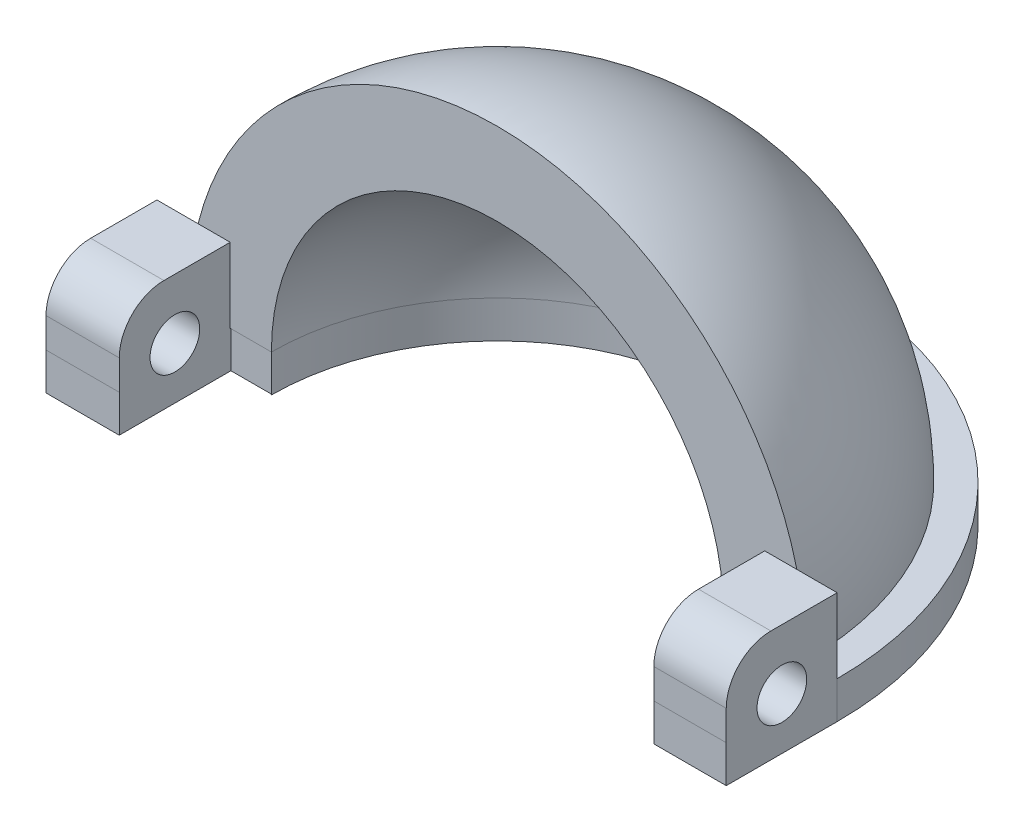
ISO-10303-21;
HEADER;
FILE_DESCRIPTION(('STEP AP214'),'2;1');
FILE_NAME('part.step','',(''),(''),'','','');
FILE_SCHEMA(('AUTOMOTIVE_DESIGN { 1 0 10303 214 1 1 1 1 }'));
ENDSEC;
DATA;
#1=APPLICATION_CONTEXT('core data for automotive mechanical design processes');
#2=APPLICATION_PROTOCOL_DEFINITION('international standard','automotive_design',2000,#1);
#3=PRODUCT_CONTEXT('',#1,'mechanical');
#4=PRODUCT('Part','Part','',(#3));
#5=PRODUCT_RELATED_PRODUCT_CATEGORY('part','',(#4));
#6=PRODUCT_DEFINITION_FORMATION('','',#4);
#7=PRODUCT_DEFINITION_CONTEXT('part definition',#1,'design');
#8=PRODUCT_DEFINITION('design','',#6,#7);
#9=PRODUCT_DEFINITION_SHAPE('','',#8);
#10=(LENGTH_UNIT() NAMED_UNIT(*) SI_UNIT(.MILLI.,.METRE.));
#11=(NAMED_UNIT(*) PLANE_ANGLE_UNIT() SI_UNIT($,.RADIAN.));
#12=(NAMED_UNIT(*) SI_UNIT($,.STERADIAN.) SOLID_ANGLE_UNIT());
#13=UNCERTAINTY_MEASURE_WITH_UNIT(LENGTH_MEASURE(1.E-05),#10,'distance_accuracy_value','');
#14=(GEOMETRIC_REPRESENTATION_CONTEXT(3) GLOBAL_UNCERTAINTY_ASSIGNED_CONTEXT((#13)) GLOBAL_UNIT_ASSIGNED_CONTEXT((#10,
#11,#12)) REPRESENTATION_CONTEXT('',''));
#15=CARTESIAN_POINT('',(0.,0.,0.));
#16=DIRECTION('',(0.,0.,1.));
#17=DIRECTION('',(1.,0.,0.));
#18=AXIS2_PLACEMENT_3D('',#15,#16,#17);
#19=CARTESIAN_POINT('',(23.2099691197334,0.,0.));
#20=DIRECTION('',(0.,-1.,0.));
#21=DIRECTION('',(0.,0.,-1.));
#22=AXIS2_PLACEMENT_3D('',#19,#20,#21);
#23=PLANE('',#22);
#24=CARTESIAN_POINT('',(23.2099691197334,0.,0.));
#25=DIRECTION('',(0.,1.,0.));
#26=DIRECTION('',(0.,0.,-1.));
#27=AXIS2_PLACEMENT_3D('',#24,#25,#26);
#28=CIRCLE('',#27,23.2099691197334);
#29=CARTESIAN_POINT('',(46.4199382394668,0.,0.));
#30=VERTEX_POINT('',#29);
#31=CARTESIAN_POINT('',(0.,0.,0.));
#32=VERTEX_POINT('',#31);
#33=EDGE_CURVE('E324',#30,#32,#28,.T.);
#34=ORIENTED_EDGE('',*,*,#33,.F.);
#35=DIRECTION('',(-0.999948416046486,0.,-0.0101570293947094));
#36=VECTOR('',#35,1.);
#37=CARTESIAN_POINT('',(23.2123635819102,0.,-0.235732177974427));
#38=LINE('',#37,#36);
#39=CARTESIAN_POINT('',(41.4977628366429,0.,-0.0499972593086982));
#40=VERTEX_POINT('',#39);
#41=EDGE_CURVE('E11',#30,#40,#38,.T.);
#42=ORIENTED_EDGE('',*,*,#41,.T.);
#43=DIRECTION('',(1.,0.,0.));
#44=VECTOR('',#43,1.);
#45=CARTESIAN_POINT('',(38.664807537657,0.,-0.0499972593086982));
#46=LINE('',#45,#44);
#47=CARTESIAN_POINT('',(38.664807537657,0.,-0.0499972593086982));
#48=VERTEX_POINT('',#47);
#49=EDGE_CURVE('E213',#48,#40,#46,.T.);
#50=ORIENTED_EDGE('',*,*,#49,.F.);
#51=DIRECTION('',(0.,0.,1.));
#52=VECTOR('',#51,1.);
#53=CARTESIAN_POINT('',(38.664807537657,0.,-0.0499972593086982));
#54=LINE('',#53,#52);
#55=CARTESIAN_POINT('',(38.664807537657,0.,0.));
#56=VERTEX_POINT('',#55);
#57=EDGE_CURVE('E194',#48,#56,#54,.T.);
#58=ORIENTED_EDGE('',*,*,#57,.T.);
#59=CARTESIAN_POINT('',(23.2380511651513,0.,0.));
#60=DIRECTION('',(0.,-1.,0.));
#61=DIRECTION('',(0.,0.,-1.));
#62=AXIS2_PLACEMENT_3D('',#59,#60,#61);
#63=CIRCLE('',#62,15.4267563725057);
#64=CARTESIAN_POINT('',(7.81129479264564,0.,0.));
#65=VERTEX_POINT('',#64);
#66=EDGE_CURVE('E340',#65,#56,#63,.T.);
#67=ORIENTED_EDGE('',*,*,#66,.F.);
#68=DIRECTION('',(0.,0.,1.));
#69=VECTOR('',#68,1.);
#70=CARTESIAN_POINT('',(7.81129479264564,0.,-0.0499972593086982));
#71=LINE('',#70,#69);
#72=CARTESIAN_POINT('',(7.81129479264564,0.,-0.0499972593086982));
#73=VERTEX_POINT('',#72);
#74=EDGE_CURVE('E254',#73,#65,#71,.T.);
#75=ORIENTED_EDGE('',*,*,#74,.F.);
#76=DIRECTION('',(1.,0.,0.));
#77=VECTOR('',#76,1.);
#78=CARTESIAN_POINT('',(4.99931890190692,0.,-0.0499972593086982));
#79=LINE('',#78,#77);
#80=CARTESIAN_POINT('',(4.99931890190692,0.,-0.0499972593086982));
#81=VERTEX_POINT('',#80);
#82=EDGE_CURVE('E236',#81,#73,#79,.T.);
#83=ORIENTED_EDGE('',*,*,#82,.F.);
#84=DIRECTION('',(0.,0.,1.));
#85=VECTOR('',#84,1.);
#86=CARTESIAN_POINT('',(4.99931890190692,0.,-0.0499972593086982));
#87=LINE('',#86,#85);
#88=CARTESIAN_POINT('',(4.99931890190692,0.,7.57000274069132));
#89=VERTEX_POINT('',#88);
#90=EDGE_CURVE('E245',#81,#89,#87,.T.);
#91=ORIENTED_EDGE('',*,*,#90,.T.);
#92=DIRECTION('',(1.,0.,0.));
#93=VECTOR('',#92,1.);
#94=CARTESIAN_POINT('',(0.,0.,7.57000274069132));
#95=LINE('',#94,#93);
#96=CARTESIAN_POINT('',(0.,0.,7.57000274069132));
#97=VERTEX_POINT('',#96);
#98=EDGE_CURVE('E337',#97,#89,#95,.T.);
#99=ORIENTED_EDGE('',*,*,#98,.F.);
#100=DIRECTION('',(0.,0.,1.));
#101=VECTOR('',#100,1.);
#102=CARTESIAN_POINT('',(0.,0.,0.));
#103=LINE('',#102,#101);
#104=EDGE_CURVE('E334',#32,#97,#103,.T.);
#105=ORIENTED_EDGE('',*,*,#104,.F.);
#106=EDGE_LOOP('',(#34,#42,#50,#58,#67,#75,#83,#91,#99,#105));
#107=FACE_BOUND('',#106,.T.);
#108=ADVANCED_FACE('F35',(#107),#23,.T.);
#109=CARTESIAN_POINT('',(0.,4.572,4.52200274069132));
#110=DIRECTION('',(-1.,0.,0.));
#111=DIRECTION('',(0.,0.,1.));
#112=AXIS2_PLACEMENT_3D('',#109,#110,#111);
#113=CYLINDRICAL_SURFACE('',#112,3.048);
#114=DIRECTION('',(-1.,0.,0.));
#115=VECTOR('',#114,1.);
#116=CARTESIAN_POINT('',(0.,4.572,7.57000274069132));
#117=LINE('',#116,#115);
#118=CARTESIAN_POINT('',(4.99931890190692,4.572,7.57000274069132));
#119=VERTEX_POINT('',#118);
#120=CARTESIAN_POINT('',(0.,4.572,7.57000274069132));
#121=VERTEX_POINT('',#120);
#122=EDGE_CURVE('E384',#119,#121,#117,.T.);
#123=ORIENTED_EDGE('',*,*,#122,.F.);
#124=CARTESIAN_POINT('',(4.99931890190692,4.572,4.52200274069132));
#125=DIRECTION('',(-1.,0.,0.));
#126=DIRECTION('',(0.,0.,1.));
#127=AXIS2_PLACEMENT_3D('',#124,#125,#126);
#128=CIRCLE('',#127,3.048);
#129=CARTESIAN_POINT('',(4.99931890190692,7.62,4.52200274069132));
#130=VERTEX_POINT('',#129);
#131=EDGE_CURVE('E390',#130,#119,#128,.F.);
#132=ORIENTED_EDGE('',*,*,#131,.F.);
#133=DIRECTION('',(-1.,0.,0.));
#134=VECTOR('',#133,1.);
#135=CARTESIAN_POINT('',(0.,7.62,4.52200274069132));
#136=LINE('',#135,#134);
#137=CARTESIAN_POINT('',(0.,7.62,4.52200274069132));
#138=VERTEX_POINT('',#137);
#139=EDGE_CURVE('E387',#138,#130,#136,.F.);
#140=ORIENTED_EDGE('',*,*,#139,.F.);
#141=CARTESIAN_POINT('',(0.,4.572,4.52200274069132));
#142=DIRECTION('',(1.,0.,0.));
#143=DIRECTION('',(0.,0.,-1.));
#144=AXIS2_PLACEMENT_3D('',#141,#142,#143);
#145=CIRCLE('',#144,3.048);
#146=EDGE_CURVE('E59',#121,#138,#145,.F.);
#147=ORIENTED_EDGE('',*,*,#146,.F.);
#148=EDGE_LOOP('',(#123,#132,#140,#147));
#149=FACE_BOUND('',#148,.T.);
#150=ADVANCED_FACE('F37',(#149),#113,.T.);
#151=CARTESIAN_POINT('',(0.,2.54,7.57000274069132));
#152=DIRECTION('',(0.,0.,-1.));
#153=DIRECTION('',(-1.,0.,0.));
#154=AXIS2_PLACEMENT_3D('',#151,#152,#153);
#155=PLANE('',#154);
#156=DIRECTION('',(0.,-1.,0.));
#157=VECTOR('',#156,1.);
#158=CARTESIAN_POINT('',(4.99931890190692,7.62,7.57000274069132));
#159=LINE('',#158,#157);
#160=CARTESIAN_POINT('',(4.99931890190692,2.54,7.57000274069132));
#161=VERTEX_POINT('',#160);
#162=EDGE_CURVE('E276',#119,#161,#159,.T.);
#163=ORIENTED_EDGE('',*,*,#162,.F.);
#164=ORIENTED_EDGE('',*,*,#122,.T.);
#165=DIRECTION('',(0.,-1.,0.));
#166=VECTOR('',#165,1.);
#167=CARTESIAN_POINT('',(0.,2.54,7.57000274069132));
#168=LINE('',#167,#166);
#169=CARTESIAN_POINT('',(0.,2.54000000000058,7.57000274069132));
#170=VERTEX_POINT('',#169);
#171=EDGE_CURVE('E357',#121,#170,#168,.T.);
#172=ORIENTED_EDGE('',*,*,#171,.T.);
#173=DIRECTION('',(-1.,-2.31703882831254E-13,0.));
#174=VECTOR('',#173,1.);
#175=CARTESIAN_POINT('',(0.,2.54,7.57000274069132));
#176=LINE('',#175,#174);
#177=EDGE_CURVE('E380',#161,#170,#176,.T.);
#178=ORIENTED_EDGE('',*,*,#177,.F.);
#179=EDGE_LOOP('',(#163,#164,#172,#178));
#180=FACE_BOUND('',#179,.T.);
#181=ADVANCED_FACE('F483',(#180),#155,.F.);
#182=CARTESIAN_POINT('',(38.664807537657,4.572,4.52200274069132));
#183=DIRECTION('',(1.,0.,0.));
#184=DIRECTION('',(0.,0.,-1.));
#185=AXIS2_PLACEMENT_3D('',#182,#183,#184);
#186=CYLINDRICAL_SURFACE('',#185,3.048);
#187=DIRECTION('',(-1.,0.,0.));
#188=VECTOR('',#187,1.);
#189=CARTESIAN_POINT('',(38.664807537657,4.572,7.57000274069132));
#190=LINE('',#189,#188);
#191=CARTESIAN_POINT('',(46.4199382394668,4.572,7.57000274069132));
#192=VERTEX_POINT('',#191);
#193=CARTESIAN_POINT('',(41.4772711538672,4.572,7.57000274069132));
#194=VERTEX_POINT('',#193);
#195=EDGE_CURVE('E370',#192,#194,#190,.T.);
#196=ORIENTED_EDGE('',*,*,#195,.F.);
#197=CARTESIAN_POINT('',(46.4199382394668,4.572,4.52200274069132));
#198=DIRECTION('',(-1.,0.,0.));
#199=DIRECTION('',(0.,0.,1.));
#200=AXIS2_PLACEMENT_3D('',#197,#198,#199);
#201=CIRCLE('',#200,3.048);
#202=CARTESIAN_POINT('',(46.4199382394668,7.62,4.52200274069132));
#203=VERTEX_POINT('',#202);
#204=EDGE_CURVE('E376',#203,#192,#201,.F.);
#205=ORIENTED_EDGE('',*,*,#204,.F.);
#206=DIRECTION('',(-1.,0.,0.));
#207=VECTOR('',#206,1.);
#208=CARTESIAN_POINT('',(38.664807537657,7.62,4.52200274069132));
#209=LINE('',#208,#207);
#210=CARTESIAN_POINT('',(41.4772711538672,7.62,4.52200274069132));
#211=VERTEX_POINT('',#210);
#212=EDGE_CURVE('E373',#211,#203,#209,.F.);
#213=ORIENTED_EDGE('',*,*,#212,.F.);
#214=CARTESIAN_POINT('',(41.4772711538672,4.572,4.52200274069132));
#215=DIRECTION('',(1.,0.,0.));
#216=DIRECTION('',(0.,0.,-1.));
#217=AXIS2_PLACEMENT_3D('',#214,#215,#216);
#218=CIRCLE('',#217,3.048);
#219=EDGE_CURVE('E378',#194,#211,#218,.F.);
#220=ORIENTED_EDGE('',*,*,#219,.F.);
#221=EDGE_LOOP('',(#196,#205,#213,#220));
#222=FACE_BOUND('',#221,.T.);
#223=ADVANCED_FACE('F456',(#222),#186,.T.);
#224=CARTESIAN_POINT('',(38.664807537657,2.54,7.57000274069132));
#225=DIRECTION('',(0.,0.,-1.));
#226=DIRECTION('',(-1.,0.,0.));
#227=AXIS2_PLACEMENT_3D('',#224,#225,#226);
#228=PLANE('',#227);
#229=DIRECTION('',(1.,0.,0.));
#230=VECTOR('',#229,1.);
#231=CARTESIAN_POINT('',(38.664807537657,2.54,7.57000274069132));
#232=LINE('',#231,#230);
#233=CARTESIAN_POINT('',(41.4977628366429,2.54,7.57000274069132));
#234=VERTEX_POINT('',#233);
#235=CARTESIAN_POINT('',(46.4199382394668,2.54,7.57000274069132));
#236=VERTEX_POINT('',#235);
#237=EDGE_CURVE('E365',#234,#236,#232,.T.);
#238=ORIENTED_EDGE('',*,*,#237,.F.);
#239=DIRECTION('',(0.,1.,0.));
#240=VECTOR('',#239,1.);
#241=CARTESIAN_POINT('',(41.4977628366429,2.54,7.57000274069132));
#242=LINE('',#241,#240);
#243=CARTESIAN_POINT('',(41.4977628366429,0.,7.57000274069132));
#244=VERTEX_POINT('',#243);
#245=EDGE_CURVE('E216',#244,#234,#242,.T.);
#246=ORIENTED_EDGE('',*,*,#245,.F.);
#247=DIRECTION('',(1.,0.,0.));
#248=VECTOR('',#247,1.);
#249=CARTESIAN_POINT('',(38.664807537657,0.,7.57000274069132));
#250=LINE('',#249,#248);
#251=CARTESIAN_POINT('',(46.4199382394668,0.,7.57000274069132));
#252=VERTEX_POINT('',#251);
#253=EDGE_CURVE('E342',#244,#252,#250,.T.);
#254=ORIENTED_EDGE('',*,*,#253,.T.);
#255=DIRECTION('',(0.,-1.,0.));
#256=VECTOR('',#255,1.);
#257=CARTESIAN_POINT('',(46.4199382394668,2.54,7.57000274069132));
#258=LINE('',#257,#256);
#259=EDGE_CURVE('E348',#236,#252,#258,.T.);
#260=ORIENTED_EDGE('',*,*,#259,.F.);
#261=EDGE_LOOP('',(#238,#246,#254,#260));
#262=FACE_BOUND('',#261,.T.);
#263=ADVANCED_FACE('F420',(#262),#228,.F.);
#264=CARTESIAN_POINT('',(23.2099691197334,2.54,0.));
#265=DIRECTION('',(0.,-1.,0.));
#266=DIRECTION('',(0.,0.,-1.));
#267=AXIS2_PLACEMENT_3D('',#264,#265,#266);
#268=PLANE('',#267);
#269=DIRECTION('',(-1.,0.,0.));
#270=VECTOR('',#269,1.);
#271=CARTESIAN_POINT('',(4.99931890190692,2.54,0.));
#272=LINE('',#271,#270);
#273=CARTESIAN_POINT('',(2.1873430111682,2.54,0.));
#274=VERTEX_POINT('',#273);
#275=CARTESIAN_POINT('',(0.,2.54,0.));
#276=VERTEX_POINT('',#275);
#277=EDGE_CURVE('E266',#274,#276,#272,.T.);
#278=ORIENTED_EDGE('',*,*,#277,.F.);
#279=CARTESIAN_POINT('',(23.2385388906228,2.54,0.));
#280=DIRECTION('',(0.,1.,0.));
#281=DIRECTION('',(0.,0.,-1.));
#282=AXIS2_PLACEMENT_3D('',#279,#280,#281);
#283=CIRCLE('',#282,21.0511958794546);
#284=CARTESIAN_POINT('',(44.2897347700774,2.54,0.));
#285=VERTEX_POINT('',#284);
#286=EDGE_CURVE('E308',#285,#274,#283,.T.);
#287=ORIENTED_EDGE('',*,*,#286,.F.);
#288=DIRECTION('',(-1.,0.,0.));
#289=VECTOR('',#288,1.);
#290=CARTESIAN_POINT('',(46.4199382394668,2.54,0.));
#291=LINE('',#290,#289);
#292=CARTESIAN_POINT('',(46.4199382394668,2.54,0.));
#293=VERTEX_POINT('',#292);
#294=EDGE_CURVE('E287',#293,#285,#291,.T.);
#295=ORIENTED_EDGE('',*,*,#294,.F.);
#296=CARTESIAN_POINT('',(23.2099691197334,2.54,0.));
#297=DIRECTION('',(0.,1.,0.));
#298=DIRECTION('',(0.,0.,-1.));
#299=AXIS2_PLACEMENT_3D('',#296,#297,#298);
#300=CIRCLE('',#299,23.2099691197334);
#301=EDGE_CURVE('E325',#293,#276,#300,.T.);
#302=ORIENTED_EDGE('',*,*,#301,.T.);
#303=EDGE_LOOP('',(#278,#287,#295,#302));
#304=FACE_BOUND('',#303,.T.);
#305=ADVANCED_FACE('F445',(#304),#268,.F.);
#306=CARTESIAN_POINT('',(23.2385388906228,2.54000000000064,6.34041430469523E-13));
#307=DIRECTION('',(0.,0.,-1.));
#308=DIRECTION('',(0.,1.,0.));
#309=AXIS2_PLACEMENT_3D('',#306,#307,#308);
#310=PLANE('',#309);
#311=DIRECTION('',(0.,-1.,0.));
#312=VECTOR('',#311,1.);
#313=CARTESIAN_POINT('',(4.99931890190692,7.62,0.));
#314=LINE('',#313,#312);
#315=CARTESIAN_POINT('',(4.99931890190691,7.62,1.31484313442523E-12));
#316=VERTEX_POINT('',#315);
#317=CARTESIAN_POINT('',(4.99931890190692,2.54,1.2059648527192E-12));
#318=VERTEX_POINT('',#317);
#319=EDGE_CURVE('E284',#316,#318,#314,.T.);
#320=ORIENTED_EDGE('',*,*,#319,.T.);
#321=DIRECTION('',(1.,0.,0.));
#322=VECTOR('',#321,1.);
#323=CARTESIAN_POINT('',(2.18734301116819,2.54000000000129,1.2941037130787E-12));
#324=LINE('',#323,#322);
#325=CARTESIAN_POINT('',(7.81129479264564,2.54,6.34041430469523E-13));
#326=VERTEX_POINT('',#325);
#327=EDGE_CURVE('E314',#318,#326,#324,.T.);
#328=ORIENTED_EDGE('',*,*,#327,.T.);
#329=CARTESIAN_POINT('',(23.2380511651513,2.54000000000064,6.34041430469523E-13));
#330=DIRECTION('',(0.,0.,-1.));
#331=DIRECTION('',(0.,-1.,0.));
#332=AXIS2_PLACEMENT_3D('',#329,#330,#331);
#333=CIRCLE('',#332,15.4267563725057);
#334=CARTESIAN_POINT('',(38.664807537657,2.54,6.34041430469523E-13));
#335=VERTEX_POINT('',#334);
#336=EDGE_CURVE('E318',#326,#335,#333,.T.);
#337=ORIENTED_EDGE('',*,*,#336,.T.);
#338=DIRECTION('',(1.,0.,0.));
#339=VECTOR('',#338,1.);
#340=CARTESIAN_POINT('',(38.664807537657,2.54,1.50487261540988E-13));
#341=LINE('',#340,#339);
#342=CARTESIAN_POINT('',(41.4772711538672,2.54,0.));
#343=VERTEX_POINT('',#342);
#344=EDGE_CURVE('E321',#335,#343,#341,.T.);
#345=ORIENTED_EDGE('',*,*,#344,.T.);
#346=DIRECTION('',(0.,-1.,0.));
#347=VECTOR('',#346,1.);
#348=CARTESIAN_POINT('',(41.4772711538672,7.62,0.));
#349=LINE('',#348,#347);
#350=CARTESIAN_POINT('',(41.4772711538672,7.62,0.));
#351=VERTEX_POINT('',#350);
#352=EDGE_CURVE('E303',#351,#343,#349,.T.);
#353=ORIENTED_EDGE('',*,*,#352,.F.);
#354=DIRECTION('',(1.,0.,0.));
#355=VECTOR('',#354,1.);
#356=CARTESIAN_POINT('',(23.2385388906228,7.62,7.43145069705384E-13));
#357=LINE('',#356,#355);
#358=CARTESIAN_POINT('',(43.6675978007922,7.62,1.02807738930427E-13));
#359=VERTEX_POINT('',#358);
#360=EDGE_CURVE('E362',#351,#359,#357,.T.);
#361=ORIENTED_EDGE('',*,*,#360,.T.);
#362=CARTESIAN_POINT('',(23.2385388906228,2.54000000000064,6.34041430469523E-13));
#363=DIRECTION('',(0.,0.,1.));
#364=DIRECTION('',(0.,1.,0.));
#365=AXIS2_PLACEMENT_3D('',#362,#363,#364);
#366=CIRCLE('',#365,21.0511958794546);
#367=CARTESIAN_POINT('',(2.80947998045337,7.62,1.38348240048034E-12));
#368=VERTEX_POINT('',#367);
#369=EDGE_CURVE('E315',#359,#368,#366,.T.);
#370=ORIENTED_EDGE('',*,*,#369,.T.);
#371=DIRECTION('',(-1.,0.,0.));
#372=VECTOR('',#371,1.);
#373=CARTESIAN_POINT('',(4.99931890190692,7.62,0.));
#374=LINE('',#373,#372);
#375=EDGE_CURVE('E270',#316,#368,#374,.T.);
#376=ORIENTED_EDGE('',*,*,#375,.F.);
#377=EDGE_LOOP('',(#320,#328,#337,#345,#353,#361,#370,#376));
#378=FACE_BOUND('',#377,.T.);
#379=ADVANCED_FACE('F515',(#378),#310,.F.);
#380=CARTESIAN_POINT('',(23.2099691197334,2.54,0.));
#381=DIRECTION('',(0.,-1.,0.));
#382=DIRECTION('',(0.,0.,-1.));
#383=AXIS2_PLACEMENT_3D('',#380,#381,#382);
#384=CYLINDRICAL_SURFACE('',#383,23.2099691197334);
#385=ORIENTED_EDGE('',*,*,#33,.T.);
#386=DIRECTION('',(0.,-1.,0.));
#387=VECTOR('',#386,1.);
#388=CARTESIAN_POINT('',(0.,2.54,0.));
#389=LINE('',#388,#387);
#390=EDGE_CURVE('E359',#276,#32,#389,.T.);
#391=ORIENTED_EDGE('',*,*,#390,.F.);
#392=ORIENTED_EDGE('',*,*,#301,.F.);
#393=DIRECTION('',(0.,-1.,0.));
#394=VECTOR('',#393,1.);
#395=CARTESIAN_POINT('',(46.4199382394668,2.54,0.));
#396=LINE('',#395,#394);
#397=EDGE_CURVE('E331',#293,#30,#396,.T.);
#398=ORIENTED_EDGE('',*,*,#397,.T.);
#399=EDGE_LOOP('',(#385,#391,#392,#398));
#400=FACE_BOUND('',#399,.T.);
#401=ADVANCED_FACE('F432',(#400),#384,.T.);
#402=CARTESIAN_POINT('',(0.,2.54,0.));
#403=DIRECTION('',(1.,0.,0.));
#404=DIRECTION('',(0.,0.,-1.));
#405=AXIS2_PLACEMENT_3D('',#402,#403,#404);
#406=PLANE('',#405);
#407=CARTESIAN_POINT('',(0.,3.53654246078802,3.77459142830657));
#408=DIRECTION('',(1.,0.,0.));
#409=DIRECTION('',(0.,0.,-1.));
#410=AXIS2_PLACEMENT_3D('',#407,#408,#409);
#411=CIRCLE('',#410,1.69551181155846);
#412=CARTESIAN_POINT('',(0.,3.53654246078802,2.0790796167481));
#413=VERTEX_POINT('',#412);
#414=EDGE_CURVE('E263',#413,#413,#411,.T.);
#415=ORIENTED_EDGE('',*,*,#414,.T.);
#416=EDGE_LOOP('',(#415));
#417=FACE_BOUND('',#416,.T.);
#418=ORIENTED_EDGE('',*,*,#171,.F.);
#419=ORIENTED_EDGE('',*,*,#146,.T.);
#420=DIRECTION('',(0.,0.,1.));
#421=VECTOR('',#420,1.);
#422=CARTESIAN_POINT('',(0.,7.62,0.));
#423=LINE('',#422,#421);
#424=CARTESIAN_POINT('',(0.,7.62,0.));
#425=VERTEX_POINT('',#424);
#426=EDGE_CURVE('E273',#425,#138,#423,.T.);
#427=ORIENTED_EDGE('',*,*,#426,.F.);
#428=DIRECTION('',(0.,-1.,0.));
#429=VECTOR('',#428,1.);
#430=CARTESIAN_POINT('',(0.,7.62,0.));
#431=LINE('',#430,#429);
#432=EDGE_CURVE('E281',#425,#276,#431,.T.);
#433=ORIENTED_EDGE('',*,*,#432,.T.);
#434=ORIENTED_EDGE('',*,*,#390,.T.);
#435=ORIENTED_EDGE('',*,*,#104,.T.);
#436=EDGE_CURVE('E356',#170,#97,#168,.T.);
#437=ORIENTED_EDGE('',*,*,#436,.F.);
#438=EDGE_LOOP('',(#418,#419,#427,#433,#434,#435,#437));
#439=FACE_BOUND('',#438,.T.);
#440=ADVANCED_FACE('F436',(#417,#439),#406,.F.);
#441=ORIENTED_EDGE('',*,*,#98,.T.);
#442=DIRECTION('',(0.,-1.,0.));
#443=VECTOR('',#442,1.);
#444=CARTESIAN_POINT('',(4.99931890190692,2.54,7.57000274069132));
#445=LINE('',#444,#443);
#446=EDGE_CURVE('E228',#161,#89,#445,.T.);
#447=ORIENTED_EDGE('',*,*,#446,.F.);
#448=ORIENTED_EDGE('',*,*,#177,.T.);
#449=ORIENTED_EDGE('',*,*,#436,.T.);
#450=EDGE_LOOP('',(#441,#447,#448,#449));
#451=FACE_BOUND('',#450,.T.);
#452=ADVANCED_FACE('F506',(#451),#155,.F.);
#453=CARTESIAN_POINT('',(23.2380511651513,2.54,0.));
#454=DIRECTION('',(0.,-1.,0.));
#455=DIRECTION('',(0.,0.,-1.));
#456=AXIS2_PLACEMENT_3D('',#453,#454,#455);
#457=CYLINDRICAL_SURFACE('',#456,15.4267563725057);
#458=ORIENTED_EDGE('',*,*,#66,.T.);
#459=DIRECTION('',(0.,-1.,0.));
#460=VECTOR('',#459,1.);
#461=CARTESIAN_POINT('',(38.664807537657,2.54,1.50668790599245E-13));
#462=LINE('',#461,#460);
#463=EDGE_CURVE('E201',#335,#56,#462,.T.);
#464=ORIENTED_EDGE('',*,*,#463,.F.);
#465=CARTESIAN_POINT('',(23.2380511651513,2.54,0.));
#466=DIRECTION('',(0.,-1.,0.));
#467=DIRECTION('',(0.,0.,-1.));
#468=AXIS2_PLACEMENT_3D('',#465,#466,#467);
#469=CIRCLE('',#468,15.4267563725057);
#470=EDGE_CURVE('E327',#326,#335,#469,.T.);
#471=ORIENTED_EDGE('',*,*,#470,.F.);
#472=DIRECTION('',(0.,-1.,0.));
#473=VECTOR('',#472,1.);
#474=CARTESIAN_POINT('',(7.81129479264564,2.54,-1.78053101776432E-13));
#475=LINE('',#474,#473);
#476=EDGE_CURVE('E353',#326,#65,#475,.T.);
#477=ORIENTED_EDGE('',*,*,#476,.T.);
#478=EDGE_LOOP('',(#458,#464,#471,#477));
#479=FACE_BOUND('',#478,.T.);
#480=ADVANCED_FACE('F500',(#479),#457,.F.);
#481=EDGE_CURVE('E349',#192,#236,#258,.T.);
#482=ORIENTED_EDGE('',*,*,#481,.F.);
#483=ORIENTED_EDGE('',*,*,#195,.T.);
#484=DIRECTION('',(0.,-1.,0.));
#485=VECTOR('',#484,1.);
#486=CARTESIAN_POINT('',(41.4772711538672,7.62,7.57000274069132));
#487=LINE('',#486,#485);
#488=CARTESIAN_POINT('',(41.4772711538672,2.54,7.57000274069132));
#489=VERTEX_POINT('',#488);
#490=EDGE_CURVE('E296',#194,#489,#487,.T.);
#491=ORIENTED_EDGE('',*,*,#490,.T.);
#492=EDGE_CURVE('E366',#489,#234,#232,.T.);
#493=ORIENTED_EDGE('',*,*,#492,.T.);
#494=ORIENTED_EDGE('',*,*,#237,.T.);
#495=EDGE_LOOP('',(#482,#483,#491,#493,#494));
#496=FACE_BOUND('',#495,.T.);
#497=ADVANCED_FACE('F459',(#496),#228,.F.);
#498=CARTESIAN_POINT('',(46.4199382394668,2.54,7.57000274069132));
#499=DIRECTION('',(-1.,0.,0.));
#500=DIRECTION('',(0.,0.,1.));
#501=AXIS2_PLACEMENT_3D('',#498,#499,#500);
#502=PLANE('',#501);
#503=CARTESIAN_POINT('',(46.4199382394668,3.53654246078802,3.77459142830657));
#504=DIRECTION('',(1.,0.,0.));
#505=DIRECTION('',(0.,0.,-1.));
#506=AXIS2_PLACEMENT_3D('',#503,#504,#505);
#507=CIRCLE('',#506,1.69551181155846);
#508=CARTESIAN_POINT('',(46.4199382394668,3.53654246078802,2.0790796167481));
#509=VERTEX_POINT('',#508);
#510=EDGE_CURVE('E250',#509,#509,#507,.T.);
#511=ORIENTED_EDGE('',*,*,#510,.F.);
#512=EDGE_LOOP('',(#511));
#513=FACE_BOUND('',#512,.T.);
#514=DIRECTION('',(0.,0.,-1.));
#515=VECTOR('',#514,1.);
#516=CARTESIAN_POINT('',(46.4199382394668,7.62,7.57000274069132));
#517=LINE('',#516,#515);
#518=CARTESIAN_POINT('',(46.4199382394668,7.62,0.));
#519=VERTEX_POINT('',#518);
#520=EDGE_CURVE('E288',#203,#519,#517,.T.);
#521=ORIENTED_EDGE('',*,*,#520,.F.);
#522=ORIENTED_EDGE('',*,*,#204,.T.);
#523=ORIENTED_EDGE('',*,*,#481,.T.);
#524=ORIENTED_EDGE('',*,*,#259,.T.);
#525=DIRECTION('',(0.,0.,-1.));
#526=VECTOR('',#525,1.);
#527=CARTESIAN_POINT('',(46.4199382394668,0.,7.57000274069132));
#528=LINE('',#527,#526);
#529=EDGE_CURVE('E328',#252,#30,#528,.T.);
#530=ORIENTED_EDGE('',*,*,#529,.T.);
#531=ORIENTED_EDGE('',*,*,#397,.F.);
#532=DIRECTION('',(0.,-1.,0.));
#533=VECTOR('',#532,1.);
#534=CARTESIAN_POINT('',(46.4199382394668,7.62,0.));
#535=LINE('',#534,#533);
#536=EDGE_CURVE('E306',#519,#293,#535,.T.);
#537=ORIENTED_EDGE('',*,*,#536,.F.);
#538=EDGE_LOOP('',(#521,#522,#523,#524,#530,#531,#537));
#539=FACE_BOUND('',#538,.T.);
#540=ADVANCED_FACE('F428',(#513,#539),#502,.F.);
#541=ORIENTED_EDGE('',*,*,#41,.F.);
#542=ORIENTED_EDGE('',*,*,#529,.F.);
#543=ORIENTED_EDGE('',*,*,#253,.F.);
#544=DIRECTION('',(0.,0.,1.));
#545=VECTOR('',#544,1.);
#546=CARTESIAN_POINT('',(41.4977628366429,0.,-0.0499972593086982));
#547=LINE('',#546,#545);
#548=EDGE_CURVE('E206',#40,#244,#547,.T.);
#549=ORIENTED_EDGE('',*,*,#548,.F.);
#550=EDGE_LOOP('',(#541,#542,#543,#549));
#551=FACE_BOUND('',#550,.T.);
#552=ADVANCED_FACE('F424',(#551),#23,.T.);
#553=CARTESIAN_POINT('',(23.2385388906228,2.54000000000064,6.34041430469523E-13));
#554=DIRECTION('',(-1.,0.,0.));
#555=DIRECTION('',(0.,-1.,0.));
#556=AXIS2_PLACEMENT_3D('',#553,#554,#555);
#557=SPHERICAL_SURFACE('',#556,21.0511958794546);
#558=ORIENTED_EDGE('',*,*,#286,.T.);
#559=EDGE_CURVE('E310',#368,#274,#366,.T.);
#560=ORIENTED_EDGE('',*,*,#559,.F.);
#561=ORIENTED_EDGE('',*,*,#369,.F.);
#562=EDGE_CURVE('E311',#285,#359,#366,.T.);
#563=ORIENTED_EDGE('',*,*,#562,.F.);
#564=EDGE_LOOP('',(#558,#560,#561,#563));
#565=FACE_BOUND('',#564,.T.);
#566=ADVANCED_FACE('F488',(#565),#557,.T.);
#567=CARTESIAN_POINT('',(23.2380511651513,2.54000000000064,6.34041430469523E-13));
#568=DIRECTION('',(-1.,0.,0.));
#569=DIRECTION('',(0.,1.,0.));
#570=AXIS2_PLACEMENT_3D('',#567,#568,#569);
#571=SPHERICAL_SURFACE('',#570,15.4267563725057);
#572=ORIENTED_EDGE('',*,*,#470,.T.);
#573=ORIENTED_EDGE('',*,*,#336,.F.);
#574=EDGE_LOOP('',(#572,#573));
#575=FACE_BOUND('',#574,.T.);
#576=ADVANCED_FACE('F493',(#575),#571,.F.);
#577=CARTESIAN_POINT('',(46.4199382394668,7.62,0.));
#578=DIRECTION('',(0.,0.,1.));
#579=DIRECTION('',(1.,0.,0.));
#580=AXIS2_PLACEMENT_3D('',#577,#578,#579);
#581=PLANE('',#580);
#582=ORIENTED_EDGE('',*,*,#294,.T.);
#583=ORIENTED_EDGE('',*,*,#562,.T.);
#584=DIRECTION('',(-1.,0.,0.));
#585=VECTOR('',#584,1.);
#586=CARTESIAN_POINT('',(46.4199382394668,7.62,0.));
#587=LINE('',#586,#585);
#588=EDGE_CURVE('E290',#519,#359,#587,.T.);
#589=ORIENTED_EDGE('',*,*,#588,.F.);
#590=ORIENTED_EDGE('',*,*,#536,.T.);
#591=EDGE_LOOP('',(#582,#583,#589,#590));
#592=FACE_BOUND('',#591,.T.);
#593=ADVANCED_FACE('F449',(#592),#581,.F.);
#594=CARTESIAN_POINT('',(41.4772711538672,7.62,7.57000274069132));
#595=DIRECTION('',(1.,0.,0.));
#596=DIRECTION('',(0.,0.,-1.));
#597=AXIS2_PLACEMENT_3D('',#594,#595,#596);
#598=PLANE('',#597);
#599=DIRECTION('',(0.,0.,1.));
#600=VECTOR('',#599,1.);
#601=CARTESIAN_POINT('',(41.4772711538672,2.54,7.57000274069132));
#602=LINE('',#601,#600);
#603=CARTESIAN_POINT('',(41.4772711538672,2.54,2.40285405293881));
#604=VERTEX_POINT('',#603);
#605=EDGE_CURVE('E291',#343,#604,#602,.T.);
#606=ORIENTED_EDGE('',*,*,#605,.T.);
#607=CARTESIAN_POINT('',(41.4772711538672,3.53654246078802,3.77459142830657));
#608=DIRECTION('',(1.,0.,0.));
#609=DIRECTION('',(0.,0.,-1.));
#610=AXIS2_PLACEMENT_3D('',#607,#608,#609);
#611=CIRCLE('',#610,1.69551181155846);
#612=CARTESIAN_POINT('',(41.4772711538672,2.54,5.14632880367433));
#613=VERTEX_POINT('',#612);
#614=EDGE_CURVE('E260',#604,#613,#611,.T.);
#615=ORIENTED_EDGE('',*,*,#614,.T.);
#616=EDGE_CURVE('E298',#613,#489,#602,.T.);
#617=ORIENTED_EDGE('',*,*,#616,.T.);
#618=ORIENTED_EDGE('',*,*,#490,.F.);
#619=ORIENTED_EDGE('',*,*,#219,.T.);
#620=DIRECTION('',(0.,0.,1.));
#621=VECTOR('',#620,1.);
#622=CARTESIAN_POINT('',(41.4772711538672,7.62,7.57000274069132));
#623=LINE('',#622,#621);
#624=EDGE_CURVE('E293',#351,#211,#623,.T.);
#625=ORIENTED_EDGE('',*,*,#624,.F.);
#626=ORIENTED_EDGE('',*,*,#352,.T.);
#627=EDGE_LOOP('',(#606,#615,#617,#618,#619,#625,#626));
#628=FACE_BOUND('',#627,.T.);
#629=ADVANCED_FACE('F408',(#628),#598,.F.);
#630=CARTESIAN_POINT('',(0.,7.62,0.));
#631=DIRECTION('',(0.,1.,0.));
#632=DIRECTION('',(0.,0.,1.));
#633=AXIS2_PLACEMENT_3D('',#630,#631,#632);
#634=PLANE('',#633);
#635=ORIENTED_EDGE('',*,*,#624,.T.);
#636=ORIENTED_EDGE('',*,*,#212,.T.);
#637=ORIENTED_EDGE('',*,*,#520,.T.);
#638=ORIENTED_EDGE('',*,*,#588,.T.);
#639=ORIENTED_EDGE('',*,*,#360,.F.);
#640=EDGE_LOOP('',(#635,#636,#637,#638,#639));
#641=FACE_BOUND('',#640,.T.);
#642=ADVANCED_FACE('F453',(#641),#634,.T.);
#643=CARTESIAN_POINT('',(4.99931890190692,7.62,0.));
#644=DIRECTION('',(-1.,0.,0.));
#645=DIRECTION('',(0.,0.,1.));
#646=AXIS2_PLACEMENT_3D('',#643,#644,#645);
#647=PLANE('',#646);
#648=CARTESIAN_POINT('',(4.99931890190692,3.53654246078802,3.77459142830657));
#649=DIRECTION('',(-1.,0.,0.));
#650=DIRECTION('',(0.,0.,1.));
#651=AXIS2_PLACEMENT_3D('',#648,#649,#650);
#652=CIRCLE('',#651,1.69551181155846);
#653=CARTESIAN_POINT('',(4.99931890190692,3.53654246078802,5.47010323986503));
#654=VERTEX_POINT('',#653);
#655=EDGE_CURVE('E393',#654,#654,#652,.T.);
#656=ORIENTED_EDGE('',*,*,#655,.T.);
#657=EDGE_LOOP('',(#656));
#658=FACE_BOUND('',#657,.T.);
#659=ORIENTED_EDGE('',*,*,#162,.T.);
#660=ORIENTED_EDGE('',*,*,#446,.T.);
#661=ORIENTED_EDGE('',*,*,#90,.F.);
#662=DIRECTION('',(0.,-1.,0.));
#663=VECTOR('',#662,1.);
#664=CARTESIAN_POINT('',(4.99931890190692,2.54,-0.0499972593086982));
#665=LINE('',#664,#663);
#666=CARTESIAN_POINT('',(4.99931890190692,2.54,-0.0499972593086982));
#667=VERTEX_POINT('',#666);
#668=EDGE_CURVE('E233',#667,#81,#665,.T.);
#669=ORIENTED_EDGE('',*,*,#668,.F.);
#670=DIRECTION('',(0.,0.,1.));
#671=VECTOR('',#670,1.);
#672=CARTESIAN_POINT('',(4.99931890190692,2.54,-0.0499972593086982));
#673=LINE('',#672,#671);
#674=EDGE_CURVE('E247',#667,#318,#673,.T.);
#675=ORIENTED_EDGE('',*,*,#674,.T.);
#676=ORIENTED_EDGE('',*,*,#319,.F.);
#677=DIRECTION('',(0.,0.,-1.));
#678=VECTOR('',#677,1.);
#679=CARTESIAN_POINT('',(4.99931890190692,7.62,0.));
#680=LINE('',#679,#678);
#681=EDGE_CURVE('E267',#130,#316,#680,.T.);
#682=ORIENTED_EDGE('',*,*,#681,.F.);
#683=ORIENTED_EDGE('',*,*,#131,.T.);
#684=EDGE_LOOP('',(#659,#660,#661,#669,#675,#676,#682,#683));
#685=FACE_BOUND('',#684,.T.);
#686=ADVANCED_FACE('F528',(#658,#685),#647,.F.);
#687=CARTESIAN_POINT('',(4.99931890190692,7.62,0.));
#688=DIRECTION('',(0.,0.,1.));
#689=DIRECTION('',(1.,0.,0.));
#690=AXIS2_PLACEMENT_3D('',#687,#688,#689);
#691=PLANE('',#690);
#692=EDGE_CURVE('E269',#368,#425,#374,.T.);
#693=ORIENTED_EDGE('',*,*,#692,.F.);
#694=ORIENTED_EDGE('',*,*,#559,.T.);
#695=ORIENTED_EDGE('',*,*,#277,.T.);
#696=ORIENTED_EDGE('',*,*,#432,.F.);
#697=EDGE_LOOP('',(#693,#694,#695,#696));
#698=FACE_BOUND('',#697,.T.);
#699=ADVANCED_FACE('F442',(#698),#691,.F.);
#700=CARTESIAN_POINT('',(0.,7.62,0.));
#701=DIRECTION('',(0.,-1.,0.));
#702=DIRECTION('',(0.,0.,-1.));
#703=AXIS2_PLACEMENT_3D('',#700,#701,#702);
#704=PLANE('',#703);
#705=ORIENTED_EDGE('',*,*,#426,.T.);
#706=ORIENTED_EDGE('',*,*,#139,.T.);
#707=ORIENTED_EDGE('',*,*,#681,.T.);
#708=ORIENTED_EDGE('',*,*,#375,.T.);
#709=ORIENTED_EDGE('',*,*,#692,.T.);
#710=EDGE_LOOP('',(#705,#706,#707,#708,#709));
#711=FACE_BOUND('',#710,.T.);
#712=ADVANCED_FACE('F532',(#711),#704,.F.);
#713=CARTESIAN_POINT('',(-4.12606176053326,3.53654246078802,3.77459142830657));
#714=DIRECTION('',(1.,0.,0.));
#715=DIRECTION('',(0.,0.,-1.));
#716=AXIS2_PLACEMENT_3D('',#713,#714,#715);
#717=CYLINDRICAL_SURFACE('',#716,1.69551181155846);
#718=ORIENTED_EDGE('',*,*,#655,.F.);
#719=EDGE_LOOP('',(#718));
#720=FACE_BOUND('',#719,.T.);
#721=ORIENTED_EDGE('',*,*,#414,.F.);
#722=EDGE_LOOP('',(#721));
#723=FACE_BOUND('',#722,.T.);
#724=ADVANCED_FACE('F569',(#720,#723),#717,.F.);
#725=ORIENTED_EDGE('',*,*,#510,.T.);
#726=EDGE_LOOP('',(#725));
#727=FACE_BOUND('',#726,.T.);
#728=CARTESIAN_POINT('',(41.4977628366429,3.53654246078802,3.77459142830657));
#729=DIRECTION('',(1.,0.,0.));
#730=DIRECTION('',(0.,0.,-1.));
#731=AXIS2_PLACEMENT_3D('',#728,#729,#730);
#732=CIRCLE('',#731,1.69551181155846);
#733=CARTESIAN_POINT('',(41.4977628366429,2.54,2.40285405293881));
#734=VERTEX_POINT('',#733);
#735=CARTESIAN_POINT('',(41.4977628366429,2.54,5.14632880367433));
#736=VERTEX_POINT('',#735);
#737=EDGE_CURVE('E396',#734,#736,#732,.F.);
#738=ORIENTED_EDGE('',*,*,#737,.T.);
#739=DIRECTION('',(1.,0.,0.));
#740=VECTOR('',#739,1.);
#741=CARTESIAN_POINT('',(-4.12606176053326,2.54,5.14632880367433));
#742=LINE('',#741,#740);
#743=EDGE_CURVE('E44',#736,#613,#742,.F.);
#744=ORIENTED_EDGE('',*,*,#743,.T.);
#745=ORIENTED_EDGE('',*,*,#614,.F.);
#746=DIRECTION('',(1.,0.,0.));
#747=VECTOR('',#746,1.);
#748=CARTESIAN_POINT('',(-4.12606176053326,2.54,2.40285405293881));
#749=LINE('',#748,#747);
#750=EDGE_CURVE('E399',#604,#734,#749,.T.);
#751=ORIENTED_EDGE('',*,*,#750,.T.);
#752=EDGE_LOOP('',(#738,#744,#745,#751));
#753=FACE_BOUND('',#752,.T.);
#754=ADVANCED_FACE('F404',(#727,#753),#717,.F.);
#755=CARTESIAN_POINT('',(4.99931890190692,2.54,-0.0499972593086982));
#756=DIRECTION('',(0.,1.,0.));
#757=DIRECTION('',(0.,0.,1.));
#758=AXIS2_PLACEMENT_3D('',#755,#756,#757);
#759=PLANE('',#758);
#760=ORIENTED_EDGE('',*,*,#674,.F.);
#761=DIRECTION('',(-1.,0.,0.));
#762=VECTOR('',#761,1.);
#763=CARTESIAN_POINT('',(4.99931890190692,2.54,-0.0499972593086982));
#764=LINE('',#763,#762);
#765=CARTESIAN_POINT('',(7.81129479264564,2.54,-0.0499972593086982));
#766=VERTEX_POINT('',#765);
#767=EDGE_CURVE('E242',#766,#667,#764,.T.);
#768=ORIENTED_EDGE('',*,*,#767,.F.);
#769=DIRECTION('',(0.,0.,1.));
#770=VECTOR('',#769,1.);
#771=CARTESIAN_POINT('',(7.81129479264564,2.54,-0.0499972593086982));
#772=LINE('',#771,#770);
#773=EDGE_CURVE('E251',#766,#326,#772,.T.);
#774=ORIENTED_EDGE('',*,*,#773,.T.);
#775=ORIENTED_EDGE('',*,*,#327,.F.);
#776=EDGE_LOOP('',(#760,#768,#774,#775));
#777=FACE_BOUND('',#776,.T.);
#778=ADVANCED_FACE('F540',(#777),#759,.F.);
#779=CARTESIAN_POINT('',(7.81129479264564,2.54,-0.0499972593086982));
#780=DIRECTION('',(1.,0.,0.));
#781=DIRECTION('',(0.,0.,-1.));
#782=AXIS2_PLACEMENT_3D('',#779,#780,#781);
#783=PLANE('',#782);
#784=ORIENTED_EDGE('',*,*,#476,.F.);
#785=ORIENTED_EDGE('',*,*,#773,.F.);
#786=DIRECTION('',(0.,1.,0.));
#787=VECTOR('',#786,1.);
#788=CARTESIAN_POINT('',(7.81129479264564,2.54,-0.0499972593086982));
#789=LINE('',#788,#787);
#790=EDGE_CURVE('E239',#73,#766,#789,.T.);
#791=ORIENTED_EDGE('',*,*,#790,.F.);
#792=ORIENTED_EDGE('',*,*,#74,.T.);
#793=EDGE_LOOP('',(#784,#785,#791,#792));
#794=FACE_BOUND('',#793,.T.);
#795=ADVANCED_FACE('F573',(#794),#783,.F.);
#796=CARTESIAN_POINT('',(0.,0.,-0.0499972593086982));
#797=DIRECTION('',(0.,0.,1.));
#798=DIRECTION('',(1.,0.,0.));
#799=AXIS2_PLACEMENT_3D('',#796,#797,#798);
#800=PLANE('',#799);
#801=ORIENTED_EDGE('',*,*,#668,.T.);
#802=ORIENTED_EDGE('',*,*,#82,.T.);
#803=ORIENTED_EDGE('',*,*,#790,.T.);
#804=ORIENTED_EDGE('',*,*,#767,.T.);
#805=EDGE_LOOP('',(#801,#802,#803,#804));
#806=FACE_BOUND('',#805,.T.);
#807=ADVANCED_FACE('F576',(#806),#800,.T.);
#808=CARTESIAN_POINT('',(38.664807537657,2.54,-0.0499972593086982));
#809=DIRECTION('',(-1.,0.,0.));
#810=DIRECTION('',(0.,0.,1.));
#811=AXIS2_PLACEMENT_3D('',#808,#809,#810);
#812=PLANE('',#811);
#813=ORIENTED_EDGE('',*,*,#57,.F.);
#814=DIRECTION('',(0.,-1.,0.));
#815=VECTOR('',#814,1.);
#816=CARTESIAN_POINT('',(38.664807537657,2.54,-0.0499972593086982));
#817=LINE('',#816,#815);
#818=CARTESIAN_POINT('',(38.664807537657,2.54,-0.0499972593086982));
#819=VERTEX_POINT('',#818);
#820=EDGE_CURVE('E198',#819,#48,#817,.T.);
#821=ORIENTED_EDGE('',*,*,#820,.F.);
#822=DIRECTION('',(0.,0.,1.));
#823=VECTOR('',#822,1.);
#824=CARTESIAN_POINT('',(38.664807537657,2.54,-0.0499972593086982));
#825=LINE('',#824,#823);
#826=EDGE_CURVE('E226',#819,#335,#825,.T.);
#827=ORIENTED_EDGE('',*,*,#826,.T.);
#828=ORIENTED_EDGE('',*,*,#463,.T.);
#829=EDGE_LOOP('',(#813,#821,#827,#828));
#830=FACE_BOUND('',#829,.T.);
#831=ADVANCED_FACE('F196',(#830),#812,.F.);
#832=CARTESIAN_POINT('',(38.664807537657,2.54,-0.0499972593086982));
#833=DIRECTION('',(0.,1.,0.));
#834=DIRECTION('',(0.,0.,1.));
#835=AXIS2_PLACEMENT_3D('',#832,#833,#834);
#836=PLANE('',#835);
#837=ORIENTED_EDGE('',*,*,#826,.F.);
#838=DIRECTION('',(-1.,0.,0.));
#839=VECTOR('',#838,1.);
#840=CARTESIAN_POINT('',(38.664807537657,2.54,-0.0499972593086982));
#841=LINE('',#840,#839);
#842=CARTESIAN_POINT('',(41.4977628366429,2.54,-0.0499972593086982));
#843=VERTEX_POINT('',#842);
#844=EDGE_CURVE('E207',#843,#819,#841,.T.);
#845=ORIENTED_EDGE('',*,*,#844,.F.);
#846=DIRECTION('',(0.,0.,1.));
#847=VECTOR('',#846,1.);
#848=CARTESIAN_POINT('',(41.4977628366429,2.54,-0.0499972593086982));
#849=LINE('',#848,#847);
#850=EDGE_CURVE('E229',#843,#734,#849,.T.);
#851=ORIENTED_EDGE('',*,*,#850,.T.);
#852=ORIENTED_EDGE('',*,*,#750,.F.);
#853=ORIENTED_EDGE('',*,*,#605,.F.);
#854=ORIENTED_EDGE('',*,*,#344,.F.);
#855=EDGE_LOOP('',(#837,#845,#851,#852,#853,#854));
#856=FACE_BOUND('',#855,.T.);
#857=ADVANCED_FACE('F413',(#856),#836,.F.);
#858=ORIENTED_EDGE('',*,*,#743,.F.);
#859=EDGE_CURVE('E51',#736,#234,#849,.T.);
#860=ORIENTED_EDGE('',*,*,#859,.T.);
#861=ORIENTED_EDGE('',*,*,#492,.F.);
#862=ORIENTED_EDGE('',*,*,#616,.F.);
#863=EDGE_LOOP('',(#858,#860,#861,#862));
#864=FACE_BOUND('',#863,.T.);
#865=ADVANCED_FACE('F469',(#864),#836,.F.);
#866=CARTESIAN_POINT('',(41.4977628366429,2.54,-0.0499972593086982));
#867=DIRECTION('',(1.,0.,0.));
#868=DIRECTION('',(0.,0.,-1.));
#869=AXIS2_PLACEMENT_3D('',#866,#867,#868);
#870=PLANE('',#869);
#871=ORIENTED_EDGE('',*,*,#850,.F.);
#872=DIRECTION('',(0.,1.,0.));
#873=VECTOR('',#872,1.);
#874=CARTESIAN_POINT('',(41.4977628366429,2.54,-0.0499972593086982));
#875=LINE('',#874,#873);
#876=EDGE_CURVE('E220',#40,#843,#875,.T.);
#877=ORIENTED_EDGE('',*,*,#876,.F.);
#878=ORIENTED_EDGE('',*,*,#548,.T.);
#879=ORIENTED_EDGE('',*,*,#245,.T.);
#880=ORIENTED_EDGE('',*,*,#859,.F.);
#881=ORIENTED_EDGE('',*,*,#737,.F.);
#882=EDGE_LOOP('',(#871,#877,#878,#879,#880,#881));
#883=FACE_BOUND('',#882,.T.);
#884=ADVANCED_FACE('F414',(#883),#870,.F.);
#885=CARTESIAN_POINT('',(0.,0.,-0.0499972593086982));
#886=DIRECTION('',(0.,0.,1.));
#887=DIRECTION('',(1.,0.,0.));
#888=AXIS2_PLACEMENT_3D('',#885,#886,#887);
#889=PLANE('',#888);
#890=ORIENTED_EDGE('',*,*,#820,.T.);
#891=ORIENTED_EDGE('',*,*,#49,.T.);
#892=ORIENTED_EDGE('',*,*,#876,.T.);
#893=ORIENTED_EDGE('',*,*,#844,.T.);
#894=EDGE_LOOP('',(#890,#891,#892,#893));
#895=FACE_BOUND('',#894,.T.);
#896=ADVANCED_FACE('F211',(#895),#889,.T.);
#897=CLOSED_SHELL('',(#108,#150,#181,#223,#263,#305,#379,#401,#440,#452,#480,#497,#540,#552,
#566,#576,#593,#629,#642,#686,#699,#712,#724,#754,#778,#795,#807,#831,#857,#865,#884,#896));
#898=MANIFOLD_SOLID_BREP('B2',#897);
#899=ADVANCED_BREP_SHAPE_REPRESENTATION('',(#18,#898),#14);
#900=SHAPE_DEFINITION_REPRESENTATION(#9,#899);
ENDSEC;
END-ISO-10303-21;
